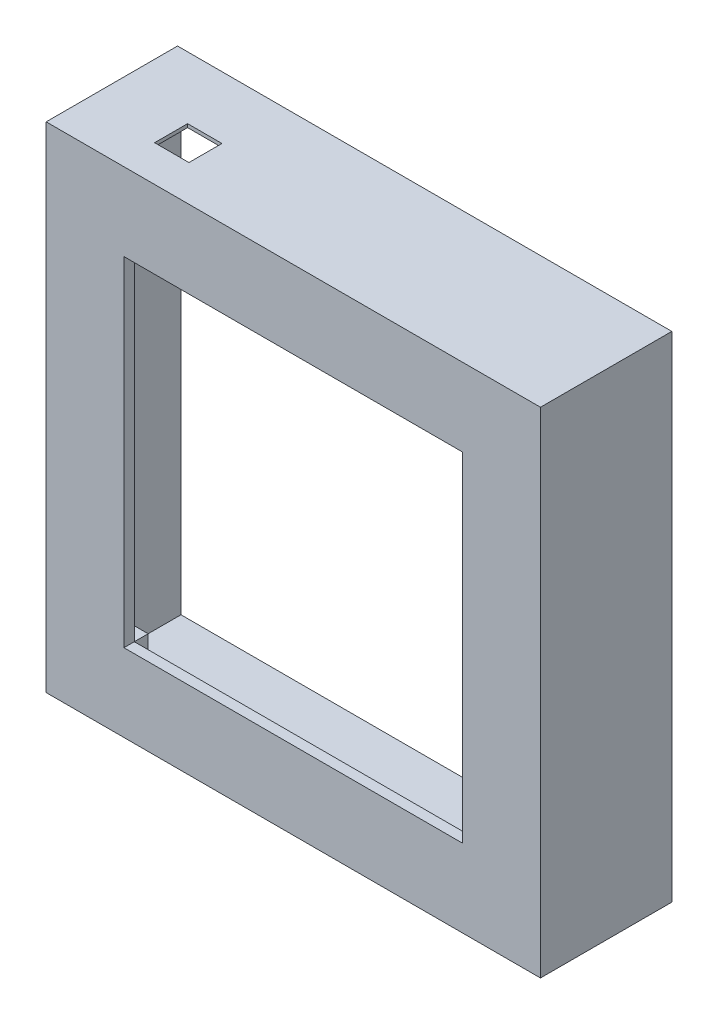
ISO-10303-21;
HEADER;
FILE_DESCRIPTION(('STEP AP214'),'2;1');
FILE_NAME('part.step','',(''),(''),'','','');
FILE_SCHEMA(('AUTOMOTIVE_DESIGN { 1 0 10303 214 1 1 1 1 }'));
ENDSEC;
DATA;
#1=APPLICATION_CONTEXT('core data for automotive mechanical design processes');
#2=APPLICATION_PROTOCOL_DEFINITION('international standard','automotive_design',2000,#1);
#3=PRODUCT_CONTEXT('',#1,'mechanical');
#4=PRODUCT('Part','Part','',(#3));
#5=PRODUCT_RELATED_PRODUCT_CATEGORY('part','',(#4));
#6=PRODUCT_DEFINITION_FORMATION('','',#4);
#7=PRODUCT_DEFINITION_CONTEXT('part definition',#1,'design');
#8=PRODUCT_DEFINITION('design','',#6,#7);
#9=PRODUCT_DEFINITION_SHAPE('','',#8);
#10=(LENGTH_UNIT() NAMED_UNIT(*) SI_UNIT(.MILLI.,.METRE.));
#11=(NAMED_UNIT(*) PLANE_ANGLE_UNIT() SI_UNIT($,.RADIAN.));
#12=(NAMED_UNIT(*) SI_UNIT($,.STERADIAN.) SOLID_ANGLE_UNIT());
#13=UNCERTAINTY_MEASURE_WITH_UNIT(LENGTH_MEASURE(1.E-05),#10,'distance_accuracy_value','');
#14=(GEOMETRIC_REPRESENTATION_CONTEXT(3) GLOBAL_UNCERTAINTY_ASSIGNED_CONTEXT((#13)) GLOBAL_UNIT_ASSIGNED_CONTEXT((#10,
#11,#12)) REPRESENTATION_CONTEXT('',''));
#15=CARTESIAN_POINT('',(0.,0.,0.));
#16=DIRECTION('',(0.,0.,1.));
#17=DIRECTION('',(1.,0.,0.));
#18=AXIS2_PLACEMENT_3D('',#15,#16,#17);
#19=CARTESIAN_POINT('',(0.,0.,0.));
#20=DIRECTION('',(0.,0.,-1.));
#21=DIRECTION('',(-1.,0.,0.));
#22=AXIS2_PLACEMENT_3D('',#19,#20,#21);
#23=PLANE('',#22);
#24=DIRECTION('',(-1.,0.,0.));
#25=VECTOR('',#24,1.);
#26=CARTESIAN_POINT('',(-49.,49.,0.));
#27=LINE('',#26,#25);
#28=CARTESIAN_POINT('',(49.,49.,0.));
#29=VERTEX_POINT('',#28);
#30=CARTESIAN_POINT('',(-49.,49.,0.));
#31=VERTEX_POINT('',#30);
#32=EDGE_CURVE('E391',#29,#31,#27,.T.);
#33=ORIENTED_EDGE('',*,*,#32,.T.);
#34=DIRECTION('',(0.,-1.,0.));
#35=VECTOR('',#34,1.);
#36=CARTESIAN_POINT('',(-49.,70.5,0.));
#37=LINE('',#36,#35);
#38=CARTESIAN_POINT('',(-49.,70.5,0.));
#39=VERTEX_POINT('',#38);
#40=EDGE_CURVE('E242',#39,#31,#37,.T.);
#41=ORIENTED_EDGE('',*,*,#40,.F.);
#42=DIRECTION('',(1.,0.,0.));
#43=VECTOR('',#42,1.);
#44=CARTESIAN_POINT('',(70.5,70.5,0.));
#45=LINE('',#44,#43);
#46=CARTESIAN_POINT('',(49.,70.5,0.));
#47=VERTEX_POINT('',#46);
#48=EDGE_CURVE('E347',#39,#47,#45,.T.);
#49=ORIENTED_EDGE('',*,*,#48,.T.);
#50=DIRECTION('',(0.,1.,0.));
#51=VECTOR('',#50,1.);
#52=CARTESIAN_POINT('',(49.,70.5,0.));
#53=LINE('',#52,#51);
#54=EDGE_CURVE('E312',#29,#47,#53,.T.);
#55=ORIENTED_EDGE('',*,*,#54,.F.);
#56=EDGE_LOOP('',(#33,#41,#49,#55));
#57=FACE_BOUND('',#56,.T.);
#58=ADVANCED_FACE('F35',(#57),#23,.T.);
#59=DIRECTION('',(0.,1.,0.));
#60=VECTOR('',#59,1.);
#61=CARTESIAN_POINT('',(-70.5,-70.5,0.));
#62=LINE('',#61,#60);
#63=CARTESIAN_POINT('',(-70.5,-49.,0.));
#64=VERTEX_POINT('',#63);
#65=CARTESIAN_POINT('',(-70.5,49.,0.));
#66=VERTEX_POINT('',#65);
#67=EDGE_CURVE('E333',#64,#66,#62,.T.);
#68=ORIENTED_EDGE('',*,*,#67,.T.);
#69=DIRECTION('',(-1.,0.,0.));
#70=VECTOR('',#69,1.);
#71=CARTESIAN_POINT('',(-70.5,49.,0.));
#72=LINE('',#71,#70);
#73=EDGE_CURVE('E246',#31,#66,#72,.T.);
#74=ORIENTED_EDGE('',*,*,#73,.F.);
#75=DIRECTION('',(0.,-1.,0.));
#76=VECTOR('',#75,1.);
#77=CARTESIAN_POINT('',(-49.,-49.,0.));
#78=LINE('',#77,#76);
#79=CARTESIAN_POINT('',(-49.,-49.,0.));
#80=VERTEX_POINT('',#79);
#81=EDGE_CURVE('E394',#31,#80,#78,.T.);
#82=ORIENTED_EDGE('',*,*,#81,.T.);
#83=DIRECTION('',(1.,0.,0.));
#84=VECTOR('',#83,1.);
#85=CARTESIAN_POINT('',(-70.5,-49.,0.));
#86=LINE('',#85,#84);
#87=EDGE_CURVE('E262',#64,#80,#86,.T.);
#88=ORIENTED_EDGE('',*,*,#87,.F.);
#89=EDGE_LOOP('',(#68,#74,#82,#88));
#90=FACE_BOUND('',#89,.T.);
#91=ADVANCED_FACE('F452',(#90),#23,.T.);
#92=CARTESIAN_POINT('',(-70.5,-70.5,-35.));
#93=DIRECTION('',(1.,0.,0.));
#94=DIRECTION('',(0.,0.,-1.));
#95=AXIS2_PLACEMENT_3D('',#92,#93,#94);
#96=PLANE('',#95);
#97=DIRECTION('',(0.,1.,0.));
#98=VECTOR('',#97,1.);
#99=CARTESIAN_POINT('',(-70.5,70.5,-4.));
#100=LINE('',#99,#98);
#101=CARTESIAN_POINT('',(-70.5,49.,-4.));
#102=VERTEX_POINT('',#101);
#103=CARTESIAN_POINT('',(-70.5,70.5,-4.));
#104=VERTEX_POINT('',#103);
#105=EDGE_CURVE('E243',#102,#104,#100,.T.);
#106=ORIENTED_EDGE('',*,*,#105,.F.);
#107=DIRECTION('',(0.,0.,1.));
#108=VECTOR('',#107,1.);
#109=CARTESIAN_POINT('',(-70.5,49.,-4.));
#110=LINE('',#109,#108);
#111=EDGE_CURVE('E252',#102,#66,#110,.T.);
#112=ORIENTED_EDGE('',*,*,#111,.T.);
#113=ORIENTED_EDGE('',*,*,#67,.F.);
#114=DIRECTION('',(0.,0.,1.));
#115=VECTOR('',#114,1.);
#116=CARTESIAN_POINT('',(-70.5,-49.,-4.));
#117=LINE('',#116,#115);
#118=CARTESIAN_POINT('',(-70.5,-49.,-4.));
#119=VERTEX_POINT('',#118);
#120=EDGE_CURVE('E284',#119,#64,#117,.T.);
#121=ORIENTED_EDGE('',*,*,#120,.F.);
#122=DIRECTION('',(0.,1.,0.));
#123=VECTOR('',#122,1.);
#124=CARTESIAN_POINT('',(-70.5,-70.5,-4.));
#125=LINE('',#124,#123);
#126=CARTESIAN_POINT('',(-70.5,-70.5,-4.));
#127=VERTEX_POINT('',#126);
#128=EDGE_CURVE('E263',#127,#119,#125,.T.);
#129=ORIENTED_EDGE('',*,*,#128,.F.);
#130=DIRECTION('',(0.,0.,1.));
#131=VECTOR('',#130,1.);
#132=CARTESIAN_POINT('',(-70.5,-70.5,-35.));
#133=LINE('',#132,#131);
#134=CARTESIAN_POINT('',(-70.5,-70.5,-35.));
#135=VERTEX_POINT('',#134);
#136=EDGE_CURVE('E344',#135,#127,#133,.T.);
#137=ORIENTED_EDGE('',*,*,#136,.F.);
#138=DIRECTION('',(0.,1.,0.));
#139=VECTOR('',#138,1.);
#140=CARTESIAN_POINT('',(-70.5,-70.5,-35.));
#141=LINE('',#140,#139);
#142=CARTESIAN_POINT('',(-70.5,70.5,-35.));
#143=VERTEX_POINT('',#142);
#144=EDGE_CURVE('E334',#135,#143,#141,.T.);
#145=ORIENTED_EDGE('',*,*,#144,.T.);
#146=DIRECTION('',(0.,0.,1.));
#147=VECTOR('',#146,1.);
#148=CARTESIAN_POINT('',(-70.5,70.5,-35.));
#149=LINE('',#148,#147);
#150=EDGE_CURVE('E362',#143,#104,#149,.T.);
#151=ORIENTED_EDGE('',*,*,#150,.T.);
#152=EDGE_LOOP('',(#106,#112,#113,#121,#129,#137,#145,#151));
#153=FACE_BOUND('',#152,.T.);
#154=ADVANCED_FACE('F459',(#153),#96,.T.);
#155=CARTESIAN_POINT('',(70.5,70.5,-35.));
#156=DIRECTION('',(0.,-1.,0.));
#157=DIRECTION('',(0.,0.,-1.));
#158=AXIS2_PLACEMENT_3D('',#155,#156,#157);
#159=PLANE('',#158);
#160=DIRECTION('',(0.,0.,-1.));
#161=VECTOR('',#160,1.);
#162=CARTESIAN_POINT('',(-50.5884615001161,70.5,-35.));
#163=LINE('',#162,#161);
#164=CARTESIAN_POINT('',(-50.5884615001161,70.5,-7.45399366961408));
#165=VERTEX_POINT('',#164);
#166=CARTESIAN_POINT('',(-50.5884615001161,70.5,-17.003856299738));
#167=VERTEX_POINT('',#166);
#168=EDGE_CURVE('E240',#165,#167,#163,.T.);
#169=ORIENTED_EDGE('',*,*,#168,.F.);
#170=DIRECTION('',(-1.,0.,0.));
#171=VECTOR('',#170,1.);
#172=CARTESIAN_POINT('',(70.5,70.5,-7.45399366961408));
#173=LINE('',#172,#171);
#174=CARTESIAN_POINT('',(-40.651442276879,70.5,-7.45399366961408));
#175=VERTEX_POINT('',#174);
#176=EDGE_CURVE('E233',#175,#165,#173,.T.);
#177=ORIENTED_EDGE('',*,*,#176,.F.);
#178=DIRECTION('',(0.,0.,1.));
#179=VECTOR('',#178,1.);
#180=CARTESIAN_POINT('',(-40.651442276879,70.5,-35.));
#181=LINE('',#180,#179);
#182=CARTESIAN_POINT('',(-40.651442276879,70.5,-17.003856299738));
#183=VERTEX_POINT('',#182);
#184=EDGE_CURVE('E213',#183,#175,#181,.T.);
#185=ORIENTED_EDGE('',*,*,#184,.F.);
#186=DIRECTION('',(1.,0.,0.));
#187=VECTOR('',#186,1.);
#188=CARTESIAN_POINT('',(70.5,70.5,-17.003856299738));
#189=LINE('',#188,#187);
#190=EDGE_CURVE('E238',#167,#183,#189,.T.);
#191=ORIENTED_EDGE('',*,*,#190,.F.);
#192=EDGE_LOOP('',(#169,#177,#185,#191));
#193=FACE_BOUND('',#192,.T.);
#194=ORIENTED_EDGE('',*,*,#48,.F.);
#195=DIRECTION('',(0.,0.,1.));
#196=VECTOR('',#195,1.);
#197=CARTESIAN_POINT('',(-49.,70.5,-4.));
#198=LINE('',#197,#196);
#199=CARTESIAN_POINT('',(-49.,70.5,-4.));
#200=VERTEX_POINT('',#199);
#201=EDGE_CURVE('E260',#200,#39,#198,.T.);
#202=ORIENTED_EDGE('',*,*,#201,.F.);
#203=DIRECTION('',(1.,0.,0.));
#204=VECTOR('',#203,1.);
#205=CARTESIAN_POINT('',(-70.5,70.5,-4.));
#206=LINE('',#205,#204);
#207=EDGE_CURVE('E245',#104,#200,#206,.T.);
#208=ORIENTED_EDGE('',*,*,#207,.F.);
#209=ORIENTED_EDGE('',*,*,#150,.F.);
#210=DIRECTION('',(1.,0.,0.));
#211=VECTOR('',#210,1.);
#212=CARTESIAN_POINT('',(70.5,70.5,-35.));
#213=LINE('',#212,#211);
#214=CARTESIAN_POINT('',(70.5,70.5,-35.));
#215=VERTEX_POINT('',#214);
#216=EDGE_CURVE('E336',#143,#215,#213,.T.);
#217=ORIENTED_EDGE('',*,*,#216,.T.);
#218=DIRECTION('',(0.,0.,1.));
#219=VECTOR('',#218,1.);
#220=CARTESIAN_POINT('',(70.5,70.5,-35.));
#221=LINE('',#220,#219);
#222=CARTESIAN_POINT('',(70.5,70.5,-4.));
#223=VERTEX_POINT('',#222);
#224=EDGE_CURVE('E359',#215,#223,#221,.T.);
#225=ORIENTED_EDGE('',*,*,#224,.T.);
#226=DIRECTION('',(1.,0.,0.));
#227=VECTOR('',#226,1.);
#228=CARTESIAN_POINT('',(70.5,70.5,-4.));
#229=LINE('',#228,#227);
#230=CARTESIAN_POINT('',(49.,70.5,-4.));
#231=VERTEX_POINT('',#230);
#232=EDGE_CURVE('E317',#231,#223,#229,.T.);
#233=ORIENTED_EDGE('',*,*,#232,.F.);
#234=DIRECTION('',(0.,0.,1.));
#235=VECTOR('',#234,1.);
#236=CARTESIAN_POINT('',(49.,70.5,-4.));
#237=LINE('',#236,#235);
#238=EDGE_CURVE('E320',#231,#47,#237,.T.);
#239=ORIENTED_EDGE('',*,*,#238,.T.);
#240=EDGE_LOOP('',(#194,#202,#208,#209,#217,#225,#233,#239));
#241=FACE_BOUND('',#240,.T.);
#242=ADVANCED_FACE('F475',(#193,#241),#159,.T.);
#243=DIRECTION('',(-1.,0.,0.));
#244=VECTOR('',#243,1.);
#245=CARTESIAN_POINT('',(70.5,-70.5,0.));
#246=LINE('',#245,#244);
#247=CARTESIAN_POINT('',(49.,-70.5,0.));
#248=VERTEX_POINT('',#247);
#249=CARTESIAN_POINT('',(-49.,-70.5,0.));
#250=VERTEX_POINT('',#249);
#251=EDGE_CURVE('E337',#248,#250,#246,.T.);
#252=ORIENTED_EDGE('',*,*,#251,.T.);
#253=DIRECTION('',(0.,-1.,0.));
#254=VECTOR('',#253,1.);
#255=CARTESIAN_POINT('',(-49.,-70.5,0.));
#256=LINE('',#255,#254);
#257=EDGE_CURVE('E267',#80,#250,#256,.T.);
#258=ORIENTED_EDGE('',*,*,#257,.F.);
#259=DIRECTION('',(1.,0.,0.));
#260=VECTOR('',#259,1.);
#261=CARTESIAN_POINT('',(-49.,-49.,0.));
#262=LINE('',#261,#260);
#263=CARTESIAN_POINT('',(49.,-49.,0.));
#264=VERTEX_POINT('',#263);
#265=EDGE_CURVE('E381',#80,#264,#262,.T.);
#266=ORIENTED_EDGE('',*,*,#265,.T.);
#267=DIRECTION('',(0.,1.,0.));
#268=VECTOR('',#267,1.);
#269=CARTESIAN_POINT('',(49.,-70.5,0.));
#270=LINE('',#269,#268);
#271=EDGE_CURVE('E287',#248,#264,#270,.T.);
#272=ORIENTED_EDGE('',*,*,#271,.F.);
#273=EDGE_LOOP('',(#252,#258,#266,#272));
#274=FACE_BOUND('',#273,.T.);
#275=ADVANCED_FACE('F461',(#274),#23,.T.);
#276=CARTESIAN_POINT('',(70.5,-70.5,-35.));
#277=DIRECTION('',(0.,1.,0.));
#278=DIRECTION('',(0.,0.,1.));
#279=AXIS2_PLACEMENT_3D('',#276,#277,#278);
#280=PLANE('',#279);
#281=DIRECTION('',(-1.,0.,0.));
#282=VECTOR('',#281,1.);
#283=CARTESIAN_POINT('',(-70.5,-70.5,-4.));
#284=LINE('',#283,#282);
#285=CARTESIAN_POINT('',(-49.,-70.5,-4.));
#286=VERTEX_POINT('',#285);
#287=EDGE_CURVE('E272',#286,#127,#284,.T.);
#288=ORIENTED_EDGE('',*,*,#287,.F.);
#289=DIRECTION('',(0.,0.,1.));
#290=VECTOR('',#289,1.);
#291=CARTESIAN_POINT('',(-49.,-70.5,-4.));
#292=LINE('',#291,#290);
#293=EDGE_CURVE('E275',#286,#250,#292,.T.);
#294=ORIENTED_EDGE('',*,*,#293,.T.);
#295=ORIENTED_EDGE('',*,*,#251,.F.);
#296=DIRECTION('',(0.,0.,1.));
#297=VECTOR('',#296,1.);
#298=CARTESIAN_POINT('',(49.,-70.5,-4.));
#299=LINE('',#298,#297);
#300=CARTESIAN_POINT('',(49.,-70.5,-4.));
#301=VERTEX_POINT('',#300);
#302=EDGE_CURVE('E305',#301,#248,#299,.T.);
#303=ORIENTED_EDGE('',*,*,#302,.F.);
#304=DIRECTION('',(-1.,0.,0.));
#305=VECTOR('',#304,1.);
#306=CARTESIAN_POINT('',(70.5,-70.5,-4.));
#307=LINE('',#306,#305);
#308=CARTESIAN_POINT('',(70.5,-70.5,-4.));
#309=VERTEX_POINT('',#308);
#310=EDGE_CURVE('E290',#309,#301,#307,.T.);
#311=ORIENTED_EDGE('',*,*,#310,.F.);
#312=DIRECTION('',(0.,0.,1.));
#313=VECTOR('',#312,1.);
#314=CARTESIAN_POINT('',(70.5,-70.5,-35.));
#315=LINE('',#314,#313);
#316=CARTESIAN_POINT('',(70.5,-70.5,-35.));
#317=VERTEX_POINT('',#316);
#318=EDGE_CURVE('E356',#317,#309,#315,.T.);
#319=ORIENTED_EDGE('',*,*,#318,.F.);
#320=DIRECTION('',(-1.,0.,0.));
#321=VECTOR('',#320,1.);
#322=CARTESIAN_POINT('',(70.5,-70.5,-35.));
#323=LINE('',#322,#321);
#324=EDGE_CURVE('E342',#317,#135,#323,.T.);
#325=ORIENTED_EDGE('',*,*,#324,.T.);
#326=ORIENTED_EDGE('',*,*,#136,.T.);
#327=EDGE_LOOP('',(#288,#294,#295,#303,#311,#319,#325,#326));
#328=FACE_BOUND('',#327,.T.);
#329=ADVANCED_FACE('F464',(#328),#280,.T.);
#330=DIRECTION('',(0.,-1.,0.));
#331=VECTOR('',#330,1.);
#332=CARTESIAN_POINT('',(70.5,-70.5,0.));
#333=LINE('',#332,#331);
#334=CARTESIAN_POINT('',(70.5,49.,0.));
#335=VERTEX_POINT('',#334);
#336=CARTESIAN_POINT('',(70.5,-49.,0.));
#337=VERTEX_POINT('',#336);
#338=EDGE_CURVE('E349',#335,#337,#333,.T.);
#339=ORIENTED_EDGE('',*,*,#338,.T.);
#340=DIRECTION('',(1.,0.,0.));
#341=VECTOR('',#340,1.);
#342=CARTESIAN_POINT('',(70.5,-49.,0.));
#343=LINE('',#342,#341);
#344=EDGE_CURVE('E291',#264,#337,#343,.T.);
#345=ORIENTED_EDGE('',*,*,#344,.F.);
#346=DIRECTION('',(0.,1.,0.));
#347=VECTOR('',#346,1.);
#348=CARTESIAN_POINT('',(49.,-49.,0.));
#349=LINE('',#348,#347);
#350=EDGE_CURVE('E377',#264,#29,#349,.T.);
#351=ORIENTED_EDGE('',*,*,#350,.T.);
#352=DIRECTION('',(-1.,0.,0.));
#353=VECTOR('',#352,1.);
#354=CARTESIAN_POINT('',(70.5,49.,0.));
#355=LINE('',#354,#353);
#356=EDGE_CURVE('E307',#335,#29,#355,.T.);
#357=ORIENTED_EDGE('',*,*,#356,.F.);
#358=EDGE_LOOP('',(#339,#345,#351,#357));
#359=FACE_BOUND('',#358,.T.);
#360=ADVANCED_FACE('F455',(#359),#23,.T.);
#361=CARTESIAN_POINT('',(70.5,-70.5,-35.));
#362=DIRECTION('',(-1.,0.,0.));
#363=DIRECTION('',(0.,0.,1.));
#364=AXIS2_PLACEMENT_3D('',#361,#362,#363);
#365=PLANE('',#364);
#366=DIRECTION('',(0.,-1.,0.));
#367=VECTOR('',#366,1.);
#368=CARTESIAN_POINT('',(70.5,-70.5,-4.));
#369=LINE('',#368,#367);
#370=CARTESIAN_POINT('',(70.5,-49.,-4.));
#371=VERTEX_POINT('',#370);
#372=EDGE_CURVE('E288',#371,#309,#369,.T.);
#373=ORIENTED_EDGE('',*,*,#372,.F.);
#374=DIRECTION('',(0.,0.,1.));
#375=VECTOR('',#374,1.);
#376=CARTESIAN_POINT('',(70.5,-49.,-4.));
#377=LINE('',#376,#375);
#378=EDGE_CURVE('E297',#371,#337,#377,.T.);
#379=ORIENTED_EDGE('',*,*,#378,.T.);
#380=ORIENTED_EDGE('',*,*,#338,.F.);
#381=DIRECTION('',(0.,0.,1.));
#382=VECTOR('',#381,1.);
#383=CARTESIAN_POINT('',(70.5,49.,-4.));
#384=LINE('',#383,#382);
#385=CARTESIAN_POINT('',(70.5,49.,-4.));
#386=VERTEX_POINT('',#385);
#387=EDGE_CURVE('E330',#386,#335,#384,.T.);
#388=ORIENTED_EDGE('',*,*,#387,.F.);
#389=DIRECTION('',(0.,-1.,0.));
#390=VECTOR('',#389,1.);
#391=CARTESIAN_POINT('',(70.5,70.5,-4.));
#392=LINE('',#391,#390);
#393=EDGE_CURVE('E308',#223,#386,#392,.T.);
#394=ORIENTED_EDGE('',*,*,#393,.F.);
#395=ORIENTED_EDGE('',*,*,#224,.F.);
#396=DIRECTION('',(0.,-1.,0.));
#397=VECTOR('',#396,1.);
#398=CARTESIAN_POINT('',(70.5,-70.5,-35.));
#399=LINE('',#398,#397);
#400=EDGE_CURVE('E339',#215,#317,#399,.T.);
#401=ORIENTED_EDGE('',*,*,#400,.T.);
#402=ORIENTED_EDGE('',*,*,#318,.T.);
#403=EDGE_LOOP('',(#373,#379,#380,#388,#394,#395,#401,#402));
#404=FACE_BOUND('',#403,.T.);
#405=ADVANCED_FACE('F449',(#404),#365,.T.);
#406=CARTESIAN_POINT('',(0.,0.,3.));
#407=DIRECTION('',(0.,0.,-1.));
#408=DIRECTION('',(-1.,0.,0.));
#409=AXIS2_PLACEMENT_3D('',#406,#407,#408);
#410=PLANE('',#409);
#411=DIRECTION('',(0.,1.,0.));
#412=VECTOR('',#411,1.);
#413=CARTESIAN_POINT('',(71.5,-71.5,3.));
#414=LINE('',#413,#412);
#415=CARTESIAN_POINT('',(71.5,-71.5,3.));
#416=VERTEX_POINT('',#415);
#417=CARTESIAN_POINT('',(71.5,71.5,3.));
#418=VERTEX_POINT('',#417);
#419=EDGE_CURVE('E410',#416,#418,#414,.T.);
#420=ORIENTED_EDGE('',*,*,#419,.T.);
#421=DIRECTION('',(-1.,0.,0.));
#422=VECTOR('',#421,1.);
#423=CARTESIAN_POINT('',(-71.5,71.5,3.));
#424=LINE('',#423,#422);
#425=CARTESIAN_POINT('',(-71.5,71.5,3.));
#426=VERTEX_POINT('',#425);
#427=EDGE_CURVE('E413',#418,#426,#424,.T.);
#428=ORIENTED_EDGE('',*,*,#427,.T.);
#429=DIRECTION('',(0.,-1.,0.));
#430=VECTOR('',#429,1.);
#431=CARTESIAN_POINT('',(-71.5,-71.5,3.));
#432=LINE('',#431,#430);
#433=CARTESIAN_POINT('',(-71.5,-71.5,3.));
#434=VERTEX_POINT('',#433);
#435=EDGE_CURVE('E415',#426,#434,#432,.T.);
#436=ORIENTED_EDGE('',*,*,#435,.T.);
#437=DIRECTION('',(1.,0.,0.));
#438=VECTOR('',#437,1.);
#439=CARTESIAN_POINT('',(-71.5,-71.5,3.));
#440=LINE('',#439,#438);
#441=EDGE_CURVE('E417',#434,#416,#440,.T.);
#442=ORIENTED_EDGE('',*,*,#441,.T.);
#443=EDGE_LOOP('',(#420,#428,#436,#442));
#444=FACE_BOUND('',#443,.T.);
#445=DIRECTION('',(0.,1.,0.));
#446=VECTOR('',#445,1.);
#447=CARTESIAN_POINT('',(49.,-49.,3.));
#448=LINE('',#447,#446);
#449=CARTESIAN_POINT('',(49.,-49.,3.));
#450=VERTEX_POINT('',#449);
#451=CARTESIAN_POINT('',(49.,49.,3.));
#452=VERTEX_POINT('',#451);
#453=EDGE_CURVE('E378',#450,#452,#448,.T.);
#454=ORIENTED_EDGE('',*,*,#453,.F.);
#455=DIRECTION('',(1.,0.,0.));
#456=VECTOR('',#455,1.);
#457=CARTESIAN_POINT('',(-49.,-49.,3.));
#458=LINE('',#457,#456);
#459=CARTESIAN_POINT('',(-49.,-49.,3.));
#460=VERTEX_POINT('',#459);
#461=EDGE_CURVE('E386',#460,#450,#458,.T.);
#462=ORIENTED_EDGE('',*,*,#461,.F.);
#463=DIRECTION('',(0.,-1.,0.));
#464=VECTOR('',#463,1.);
#465=CARTESIAN_POINT('',(-49.,-49.,3.));
#466=LINE('',#465,#464);
#467=CARTESIAN_POINT('',(-49.,49.,3.));
#468=VERTEX_POINT('',#467);
#469=EDGE_CURVE('E383',#468,#460,#466,.T.);
#470=ORIENTED_EDGE('',*,*,#469,.F.);
#471=DIRECTION('',(-1.,0.,0.));
#472=VECTOR('',#471,1.);
#473=CARTESIAN_POINT('',(-49.,49.,3.));
#474=LINE('',#473,#472);
#475=EDGE_CURVE('E380',#452,#468,#474,.T.);
#476=ORIENTED_EDGE('',*,*,#475,.F.);
#477=EDGE_LOOP('',(#454,#462,#470,#476));
#478=FACE_BOUND('',#477,.T.);
#479=ADVANCED_FACE('F441',(#444,#478),#410,.F.);
#480=CARTESIAN_POINT('',(71.5,-71.5,3.));
#481=DIRECTION('',(-1.,0.,0.));
#482=DIRECTION('',(0.,0.,1.));
#483=AXIS2_PLACEMENT_3D('',#480,#481,#482);
#484=PLANE('',#483);
#485=DIRECTION('',(0.,0.,-1.));
#486=VECTOR('',#485,1.);
#487=CARTESIAN_POINT('',(71.5,-71.5,3.));
#488=LINE('',#487,#486);
#489=CARTESIAN_POINT('',(71.5,-71.5,-35.));
#490=VERTEX_POINT('',#489);
#491=EDGE_CURVE('E419',#416,#490,#488,.T.);
#492=ORIENTED_EDGE('',*,*,#491,.T.);
#493=DIRECTION('',(0.,-1.,0.));
#494=VECTOR('',#493,1.);
#495=CARTESIAN_POINT('',(71.5,-71.5,-35.));
#496=LINE('',#495,#494);
#497=CARTESIAN_POINT('',(71.5,71.5,-35.));
#498=VERTEX_POINT('',#497);
#499=EDGE_CURVE('E371',#498,#490,#496,.T.);
#500=ORIENTED_EDGE('',*,*,#499,.F.);
#501=DIRECTION('',(0.,0.,-1.));
#502=VECTOR('',#501,1.);
#503=CARTESIAN_POINT('',(71.5,71.5,3.));
#504=LINE('',#503,#502);
#505=EDGE_CURVE('E11',#418,#498,#504,.T.);
#506=ORIENTED_EDGE('',*,*,#505,.F.);
#507=ORIENTED_EDGE('',*,*,#419,.F.);
#508=EDGE_LOOP('',(#492,#500,#506,#507));
#509=FACE_BOUND('',#508,.T.);
#510=ADVANCED_FACE('F37',(#509),#484,.F.);
#511=CARTESIAN_POINT('',(-71.5,71.5,3.));
#512=DIRECTION('',(0.,-1.,0.));
#513=DIRECTION('',(0.,0.,-1.));
#514=AXIS2_PLACEMENT_3D('',#511,#512,#513);
#515=PLANE('',#514);
#516=DIRECTION('',(1.,0.,0.));
#517=VECTOR('',#516,1.);
#518=CARTESIAN_POINT('',(-50.5884615001161,71.5,-7.45399366961408));
#519=LINE('',#518,#517);
#520=CARTESIAN_POINT('',(-50.5884615001161,71.5,-7.45399366961408));
#521=VERTEX_POINT('',#520);
#522=CARTESIAN_POINT('',(-40.651442276879,71.5,-7.45399366961408));
#523=VERTEX_POINT('',#522);
#524=EDGE_CURVE('E219',#521,#523,#519,.T.);
#525=ORIENTED_EDGE('',*,*,#524,.F.);
#526=DIRECTION('',(0.,0.,1.));
#527=VECTOR('',#526,1.);
#528=CARTESIAN_POINT('',(-50.5884615001161,71.5,-7.45399366961408));
#529=LINE('',#528,#527);
#530=CARTESIAN_POINT('',(-50.5884615001161,71.5,-17.003856299738));
#531=VERTEX_POINT('',#530);
#532=EDGE_CURVE('E58',#531,#521,#529,.T.);
#533=ORIENTED_EDGE('',*,*,#532,.F.);
#534=DIRECTION('',(-1.,0.,0.));
#535=VECTOR('',#534,1.);
#536=CARTESIAN_POINT('',(-50.5884615001161,71.5,-17.003856299738));
#537=LINE('',#536,#535);
#538=CARTESIAN_POINT('',(-40.651442276879,71.5,-17.003856299738));
#539=VERTEX_POINT('',#538);
#540=EDGE_CURVE('E226',#539,#531,#537,.T.);
#541=ORIENTED_EDGE('',*,*,#540,.F.);
#542=DIRECTION('',(0.,0.,-1.));
#543=VECTOR('',#542,1.);
#544=CARTESIAN_POINT('',(-40.651442276879,71.5,-7.45399366961408));
#545=LINE('',#544,#543);
#546=EDGE_CURVE('E210',#523,#539,#545,.T.);
#547=ORIENTED_EDGE('',*,*,#546,.F.);
#548=EDGE_LOOP('',(#525,#533,#541,#547));
#549=FACE_BOUND('',#548,.T.);
#550=ORIENTED_EDGE('',*,*,#505,.T.);
#551=DIRECTION('',(1.,0.,0.));
#552=VECTOR('',#551,1.);
#553=CARTESIAN_POINT('',(71.5,71.5,-35.));
#554=LINE('',#553,#552);
#555=CARTESIAN_POINT('',(-71.5,71.5,-35.));
#556=VERTEX_POINT('',#555);
#557=EDGE_CURVE('E368',#556,#498,#554,.T.);
#558=ORIENTED_EDGE('',*,*,#557,.F.);
#559=DIRECTION('',(0.,0.,-1.));
#560=VECTOR('',#559,1.);
#561=CARTESIAN_POINT('',(-71.5,71.5,3.));
#562=LINE('',#561,#560);
#563=EDGE_CURVE('E43',#426,#556,#562,.T.);
#564=ORIENTED_EDGE('',*,*,#563,.F.);
#565=ORIENTED_EDGE('',*,*,#427,.F.);
#566=EDGE_LOOP('',(#550,#558,#564,#565));
#567=FACE_BOUND('',#566,.T.);
#568=ADVANCED_FACE('F223',(#549,#567),#515,.F.);
#569=CARTESIAN_POINT('',(-71.5,-71.5,3.));
#570=DIRECTION('',(1.,0.,0.));
#571=DIRECTION('',(0.,0.,-1.));
#572=AXIS2_PLACEMENT_3D('',#569,#570,#571);
#573=PLANE('',#572);
#574=ORIENTED_EDGE('',*,*,#563,.T.);
#575=DIRECTION('',(0.,1.,0.));
#576=VECTOR('',#575,1.);
#577=CARTESIAN_POINT('',(-71.5,-71.5,-35.));
#578=LINE('',#577,#576);
#579=CARTESIAN_POINT('',(-71.5,-71.5,-35.));
#580=VERTEX_POINT('',#579);
#581=EDGE_CURVE('E365',#580,#556,#578,.T.);
#582=ORIENTED_EDGE('',*,*,#581,.F.);
#583=DIRECTION('',(0.,0.,-1.));
#584=VECTOR('',#583,1.);
#585=CARTESIAN_POINT('',(-71.5,-71.5,3.));
#586=LINE('',#585,#584);
#587=EDGE_CURVE('E421',#434,#580,#586,.T.);
#588=ORIENTED_EDGE('',*,*,#587,.F.);
#589=ORIENTED_EDGE('',*,*,#435,.F.);
#590=EDGE_LOOP('',(#574,#582,#588,#589));
#591=FACE_BOUND('',#590,.T.);
#592=ADVANCED_FACE('F427',(#591),#573,.F.);
#593=CARTESIAN_POINT('',(-71.5,-71.5,3.));
#594=DIRECTION('',(0.,1.,0.));
#595=DIRECTION('',(0.,0.,1.));
#596=AXIS2_PLACEMENT_3D('',#593,#594,#595);
#597=PLANE('',#596);
#598=ORIENTED_EDGE('',*,*,#587,.T.);
#599=DIRECTION('',(-1.,0.,0.));
#600=VECTOR('',#599,1.);
#601=CARTESIAN_POINT('',(71.5,-71.5,-35.));
#602=LINE('',#601,#600);
#603=EDGE_CURVE('E374',#490,#580,#602,.T.);
#604=ORIENTED_EDGE('',*,*,#603,.F.);
#605=ORIENTED_EDGE('',*,*,#491,.F.);
#606=ORIENTED_EDGE('',*,*,#441,.F.);
#607=EDGE_LOOP('',(#598,#604,#605,#606));
#608=FACE_BOUND('',#607,.T.);
#609=ADVANCED_FACE('F437',(#608),#597,.F.);
#610=CARTESIAN_POINT('',(49.,-49.,3.));
#611=DIRECTION('',(-1.,0.,0.));
#612=DIRECTION('',(0.,0.,1.));
#613=AXIS2_PLACEMENT_3D('',#610,#611,#612);
#614=PLANE('',#613);
#615=ORIENTED_EDGE('',*,*,#350,.F.);
#616=DIRECTION('',(0.,0.,-1.));
#617=VECTOR('',#616,1.);
#618=CARTESIAN_POINT('',(49.,-49.,3.));
#619=LINE('',#618,#617);
#620=EDGE_CURVE('E388',#450,#264,#619,.T.);
#621=ORIENTED_EDGE('',*,*,#620,.F.);
#622=ORIENTED_EDGE('',*,*,#453,.T.);
#623=DIRECTION('',(0.,0.,-1.));
#624=VECTOR('',#623,1.);
#625=CARTESIAN_POINT('',(49.,49.,3.));
#626=LINE('',#625,#624);
#627=EDGE_CURVE('E407',#452,#29,#626,.T.);
#628=ORIENTED_EDGE('',*,*,#627,.T.);
#629=EDGE_LOOP('',(#615,#621,#622,#628));
#630=FACE_BOUND('',#629,.T.);
#631=ADVANCED_FACE('F534',(#630),#614,.T.);
#632=CARTESIAN_POINT('',(-49.,49.,3.));
#633=DIRECTION('',(0.,-1.,0.));
#634=DIRECTION('',(0.,0.,-1.));
#635=AXIS2_PLACEMENT_3D('',#632,#633,#634);
#636=PLANE('',#635);
#637=ORIENTED_EDGE('',*,*,#32,.F.);
#638=ORIENTED_EDGE('',*,*,#627,.F.);
#639=ORIENTED_EDGE('',*,*,#475,.T.);
#640=DIRECTION('',(0.,0.,-1.));
#641=VECTOR('',#640,1.);
#642=CARTESIAN_POINT('',(-49.,49.,3.));
#643=LINE('',#642,#641);
#644=EDGE_CURVE('E404',#468,#31,#643,.T.);
#645=ORIENTED_EDGE('',*,*,#644,.T.);
#646=EDGE_LOOP('',(#637,#638,#639,#645));
#647=FACE_BOUND('',#646,.T.);
#648=ADVANCED_FACE('F506',(#647),#636,.T.);
#649=CARTESIAN_POINT('',(-49.,-49.,3.));
#650=DIRECTION('',(1.,0.,0.));
#651=DIRECTION('',(0.,0.,-1.));
#652=AXIS2_PLACEMENT_3D('',#649,#650,#651);
#653=PLANE('',#652);
#654=ORIENTED_EDGE('',*,*,#81,.F.);
#655=ORIENTED_EDGE('',*,*,#644,.F.);
#656=ORIENTED_EDGE('',*,*,#469,.T.);
#657=DIRECTION('',(0.,0.,-1.));
#658=VECTOR('',#657,1.);
#659=CARTESIAN_POINT('',(-49.,-49.,3.));
#660=LINE('',#659,#658);
#661=EDGE_CURVE('E401',#460,#80,#660,.T.);
#662=ORIENTED_EDGE('',*,*,#661,.T.);
#663=EDGE_LOOP('',(#654,#655,#656,#662));
#664=FACE_BOUND('',#663,.T.);
#665=ADVANCED_FACE('F511',(#664),#653,.T.);
#666=CARTESIAN_POINT('',(-49.,-49.,3.));
#667=DIRECTION('',(0.,1.,0.));
#668=DIRECTION('',(0.,0.,1.));
#669=AXIS2_PLACEMENT_3D('',#666,#667,#668);
#670=PLANE('',#669);
#671=ORIENTED_EDGE('',*,*,#265,.F.);
#672=ORIENTED_EDGE('',*,*,#661,.F.);
#673=ORIENTED_EDGE('',*,*,#461,.T.);
#674=ORIENTED_EDGE('',*,*,#620,.T.);
#675=EDGE_LOOP('',(#671,#672,#673,#674));
#676=FACE_BOUND('',#675,.T.);
#677=ADVANCED_FACE('F537',(#676),#670,.T.);
#678=CARTESIAN_POINT('',(0.,0.,-35.));
#679=DIRECTION('',(0.,0.,1.));
#680=DIRECTION('',(1.,0.,0.));
#681=AXIS2_PLACEMENT_3D('',#678,#679,#680);
#682=PLANE('',#681);
#683=ORIENTED_EDGE('',*,*,#581,.T.);
#684=ORIENTED_EDGE('',*,*,#557,.T.);
#685=ORIENTED_EDGE('',*,*,#499,.T.);
#686=ORIENTED_EDGE('',*,*,#603,.T.);
#687=EDGE_LOOP('',(#683,#684,#685,#686));
#688=FACE_BOUND('',#687,.T.);
#689=ORIENTED_EDGE('',*,*,#144,.F.);
#690=ORIENTED_EDGE('',*,*,#324,.F.);
#691=ORIENTED_EDGE('',*,*,#400,.F.);
#692=ORIENTED_EDGE('',*,*,#216,.F.);
#693=EDGE_LOOP('',(#689,#690,#691,#692));
#694=FACE_BOUND('',#693,.T.);
#695=ADVANCED_FACE('F432',(#688,#694),#682,.F.);
#696=CARTESIAN_POINT('',(70.5,49.,-4.));
#697=DIRECTION('',(0.,1.,0.));
#698=DIRECTION('',(0.,0.,1.));
#699=AXIS2_PLACEMENT_3D('',#696,#697,#698);
#700=PLANE('',#699);
#701=ORIENTED_EDGE('',*,*,#356,.T.);
#702=DIRECTION('',(0.,0.,1.));
#703=VECTOR('',#702,1.);
#704=CARTESIAN_POINT('',(49.,49.,-4.));
#705=LINE('',#704,#703);
#706=CARTESIAN_POINT('',(49.,49.,-4.));
#707=VERTEX_POINT('',#706);
#708=EDGE_CURVE('E327',#707,#29,#705,.T.);
#709=ORIENTED_EDGE('',*,*,#708,.F.);
#710=DIRECTION('',(-1.,0.,0.));
#711=VECTOR('',#710,1.);
#712=CARTESIAN_POINT('',(70.5,49.,-4.));
#713=LINE('',#712,#711);
#714=EDGE_CURVE('E311',#386,#707,#713,.T.);
#715=ORIENTED_EDGE('',*,*,#714,.F.);
#716=ORIENTED_EDGE('',*,*,#387,.T.);
#717=EDGE_LOOP('',(#701,#709,#715,#716));
#718=FACE_BOUND('',#717,.T.);
#719=ADVANCED_FACE('F522',(#718),#700,.F.);
#720=CARTESIAN_POINT('',(49.,70.5,-4.));
#721=DIRECTION('',(1.,0.,0.));
#722=DIRECTION('',(0.,0.,-1.));
#723=AXIS2_PLACEMENT_3D('',#720,#721,#722);
#724=PLANE('',#723);
#725=ORIENTED_EDGE('',*,*,#54,.T.);
#726=ORIENTED_EDGE('',*,*,#238,.F.);
#727=DIRECTION('',(0.,1.,0.));
#728=VECTOR('',#727,1.);
#729=CARTESIAN_POINT('',(49.,70.5,-4.));
#730=LINE('',#729,#728);
#731=EDGE_CURVE('E314',#707,#231,#730,.T.);
#732=ORIENTED_EDGE('',*,*,#731,.F.);
#733=ORIENTED_EDGE('',*,*,#708,.T.);
#734=EDGE_LOOP('',(#725,#726,#732,#733));
#735=FACE_BOUND('',#734,.T.);
#736=ADVANCED_FACE('F517',(#735),#724,.F.);
#737=CARTESIAN_POINT('',(0.,0.,-4.));
#738=DIRECTION('',(0.,0.,-1.));
#739=DIRECTION('',(-1.,0.,0.));
#740=AXIS2_PLACEMENT_3D('',#737,#738,#739);
#741=PLANE('',#740);
#742=ORIENTED_EDGE('',*,*,#393,.T.);
#743=ORIENTED_EDGE('',*,*,#714,.T.);
#744=ORIENTED_EDGE('',*,*,#731,.T.);
#745=ORIENTED_EDGE('',*,*,#232,.T.);
#746=EDGE_LOOP('',(#742,#743,#744,#745));
#747=FACE_BOUND('',#746,.T.);
#748=ADVANCED_FACE('F639',(#747),#741,.T.);
#749=CARTESIAN_POINT('',(49.,-70.5,-4.));
#750=DIRECTION('',(1.,0.,0.));
#751=DIRECTION('',(0.,0.,-1.));
#752=AXIS2_PLACEMENT_3D('',#749,#750,#751);
#753=PLANE('',#752);
#754=ORIENTED_EDGE('',*,*,#271,.T.);
#755=DIRECTION('',(0.,0.,1.));
#756=VECTOR('',#755,1.);
#757=CARTESIAN_POINT('',(49.,-49.,-4.));
#758=LINE('',#757,#756);
#759=CARTESIAN_POINT('',(49.,-49.,-4.));
#760=VERTEX_POINT('',#759);
#761=EDGE_CURVE('E302',#760,#264,#758,.T.);
#762=ORIENTED_EDGE('',*,*,#761,.F.);
#763=DIRECTION('',(0.,1.,0.));
#764=VECTOR('',#763,1.);
#765=CARTESIAN_POINT('',(49.,-70.5,-4.));
#766=LINE('',#765,#764);
#767=EDGE_CURVE('E293',#301,#760,#766,.T.);
#768=ORIENTED_EDGE('',*,*,#767,.F.);
#769=ORIENTED_EDGE('',*,*,#302,.T.);
#770=EDGE_LOOP('',(#754,#762,#768,#769));
#771=FACE_BOUND('',#770,.T.);
#772=ADVANCED_FACE('F636',(#771),#753,.F.);
#773=CARTESIAN_POINT('',(70.5,-49.,-4.));
#774=DIRECTION('',(0.,-1.,0.));
#775=DIRECTION('',(0.,0.,-1.));
#776=AXIS2_PLACEMENT_3D('',#773,#774,#775);
#777=PLANE('',#776);
#778=ORIENTED_EDGE('',*,*,#344,.T.);
#779=ORIENTED_EDGE('',*,*,#378,.F.);
#780=DIRECTION('',(1.,0.,0.));
#781=VECTOR('',#780,1.);
#782=CARTESIAN_POINT('',(70.5,-49.,-4.));
#783=LINE('',#782,#781);
#784=EDGE_CURVE('E295',#760,#371,#783,.T.);
#785=ORIENTED_EDGE('',*,*,#784,.F.);
#786=ORIENTED_EDGE('',*,*,#761,.T.);
#787=EDGE_LOOP('',(#778,#779,#785,#786));
#788=FACE_BOUND('',#787,.T.);
#789=ADVANCED_FACE('F530',(#788),#777,.F.);
#790=CARTESIAN_POINT('',(0.,0.,-4.));
#791=DIRECTION('',(0.,0.,1.));
#792=DIRECTION('',(1.,0.,0.));
#793=AXIS2_PLACEMENT_3D('',#790,#791,#792);
#794=PLANE('',#793);
#795=ORIENTED_EDGE('',*,*,#372,.T.);
#796=ORIENTED_EDGE('',*,*,#310,.T.);
#797=ORIENTED_EDGE('',*,*,#767,.T.);
#798=ORIENTED_EDGE('',*,*,#784,.T.);
#799=EDGE_LOOP('',(#795,#796,#797,#798));
#800=FACE_BOUND('',#799,.T.);
#801=ADVANCED_FACE('F630',(#800),#794,.F.);
#802=CARTESIAN_POINT('',(-70.5,-49.,-4.));
#803=DIRECTION('',(0.,-1.,0.));
#804=DIRECTION('',(0.,0.,-1.));
#805=AXIS2_PLACEMENT_3D('',#802,#803,#804);
#806=PLANE('',#805);
#807=ORIENTED_EDGE('',*,*,#87,.T.);
#808=DIRECTION('',(0.,0.,1.));
#809=VECTOR('',#808,1.);
#810=CARTESIAN_POINT('',(-49.,-49.,-4.));
#811=LINE('',#810,#809);
#812=CARTESIAN_POINT('',(-49.,-49.,-4.));
#813=VERTEX_POINT('',#812);
#814=EDGE_CURVE('E281',#813,#80,#811,.T.);
#815=ORIENTED_EDGE('',*,*,#814,.F.);
#816=DIRECTION('',(1.,0.,0.));
#817=VECTOR('',#816,1.);
#818=CARTESIAN_POINT('',(-70.5,-49.,-4.));
#819=LINE('',#818,#817);
#820=EDGE_CURVE('E266',#119,#813,#819,.T.);
#821=ORIENTED_EDGE('',*,*,#820,.F.);
#822=ORIENTED_EDGE('',*,*,#120,.T.);
#823=EDGE_LOOP('',(#807,#815,#821,#822));
#824=FACE_BOUND('',#823,.T.);
#825=ADVANCED_FACE('F492',(#824),#806,.F.);
#826=CARTESIAN_POINT('',(-49.,-70.5,-4.));
#827=DIRECTION('',(-1.,0.,0.));
#828=DIRECTION('',(0.,0.,1.));
#829=AXIS2_PLACEMENT_3D('',#826,#827,#828);
#830=PLANE('',#829);
#831=ORIENTED_EDGE('',*,*,#257,.T.);
#832=ORIENTED_EDGE('',*,*,#293,.F.);
#833=DIRECTION('',(0.,-1.,0.));
#834=VECTOR('',#833,1.);
#835=CARTESIAN_POINT('',(-49.,-70.5,-4.));
#836=LINE('',#835,#834);
#837=EDGE_CURVE('E269',#813,#286,#836,.T.);
#838=ORIENTED_EDGE('',*,*,#837,.F.);
#839=ORIENTED_EDGE('',*,*,#814,.T.);
#840=EDGE_LOOP('',(#831,#832,#838,#839));
#841=FACE_BOUND('',#840,.T.);
#842=ADVANCED_FACE('F487',(#841),#830,.F.);
#843=CARTESIAN_POINT('',(0.,0.,-4.));
#844=DIRECTION('',(0.,0.,-1.));
#845=DIRECTION('',(-1.,0.,0.));
#846=AXIS2_PLACEMENT_3D('',#843,#844,#845);
#847=PLANE('',#846);
#848=ORIENTED_EDGE('',*,*,#128,.T.);
#849=ORIENTED_EDGE('',*,*,#820,.T.);
#850=ORIENTED_EDGE('',*,*,#837,.T.);
#851=ORIENTED_EDGE('',*,*,#287,.T.);
#852=EDGE_LOOP('',(#848,#849,#850,#851));
#853=FACE_BOUND('',#852,.T.);
#854=ADVANCED_FACE('F621',(#853),#847,.T.);
#855=CARTESIAN_POINT('',(-49.,70.5,-4.));
#856=DIRECTION('',(-1.,0.,0.));
#857=DIRECTION('',(0.,0.,1.));
#858=AXIS2_PLACEMENT_3D('',#855,#856,#857);
#859=PLANE('',#858);
#860=ORIENTED_EDGE('',*,*,#40,.T.);
#861=DIRECTION('',(0.,0.,1.));
#862=VECTOR('',#861,1.);
#863=CARTESIAN_POINT('',(-49.,49.,-4.));
#864=LINE('',#863,#862);
#865=CARTESIAN_POINT('',(-49.,49.,-4.));
#866=VERTEX_POINT('',#865);
#867=EDGE_CURVE('E257',#866,#31,#864,.T.);
#868=ORIENTED_EDGE('',*,*,#867,.F.);
#869=DIRECTION('',(0.,-1.,0.));
#870=VECTOR('',#869,1.);
#871=CARTESIAN_POINT('',(-49.,70.5,-4.));
#872=LINE('',#871,#870);
#873=EDGE_CURVE('E248',#200,#866,#872,.T.);
#874=ORIENTED_EDGE('',*,*,#873,.F.);
#875=ORIENTED_EDGE('',*,*,#201,.T.);
#876=EDGE_LOOP('',(#860,#868,#874,#875));
#877=FACE_BOUND('',#876,.T.);
#878=ADVANCED_FACE('F618',(#877),#859,.F.);
#879=CARTESIAN_POINT('',(-70.5,49.,-4.));
#880=DIRECTION('',(0.,1.,0.));
#881=DIRECTION('',(0.,0.,1.));
#882=AXIS2_PLACEMENT_3D('',#879,#880,#881);
#883=PLANE('',#882);
#884=ORIENTED_EDGE('',*,*,#73,.T.);
#885=ORIENTED_EDGE('',*,*,#111,.F.);
#886=DIRECTION('',(-1.,0.,0.));
#887=VECTOR('',#886,1.);
#888=CARTESIAN_POINT('',(-70.5,49.,-4.));
#889=LINE('',#888,#887);
#890=EDGE_CURVE('E250',#866,#102,#889,.T.);
#891=ORIENTED_EDGE('',*,*,#890,.F.);
#892=ORIENTED_EDGE('',*,*,#867,.T.);
#893=EDGE_LOOP('',(#884,#885,#891,#892));
#894=FACE_BOUND('',#893,.T.);
#895=ADVANCED_FACE('F501',(#894),#883,.F.);
#896=CARTESIAN_POINT('',(0.,0.,-4.));
#897=DIRECTION('',(0.,0.,1.));
#898=DIRECTION('',(1.,0.,0.));
#899=AXIS2_PLACEMENT_3D('',#896,#897,#898);
#900=PLANE('',#899);
#901=ORIENTED_EDGE('',*,*,#105,.T.);
#902=ORIENTED_EDGE('',*,*,#207,.T.);
#903=ORIENTED_EDGE('',*,*,#873,.T.);
#904=ORIENTED_EDGE('',*,*,#890,.T.);
#905=EDGE_LOOP('',(#901,#902,#903,#904));
#906=FACE_BOUND('',#905,.T.);
#907=ADVANCED_FACE('F582',(#906),#900,.F.);
#908=CARTESIAN_POINT('',(-50.5884615001161,67.5,-7.45399366961408));
#909=DIRECTION('',(-1.,0.,0.));
#910=DIRECTION('',(0.,0.,1.));
#911=AXIS2_PLACEMENT_3D('',#908,#909,#910);
#912=PLANE('',#911);
#913=ORIENTED_EDGE('',*,*,#168,.T.);
#914=DIRECTION('',(0.,1.,0.));
#915=VECTOR('',#914,1.);
#916=CARTESIAN_POINT('',(-50.5884615001161,67.5,-17.003856299738));
#917=LINE('',#916,#915);
#918=EDGE_CURVE('E231',#167,#531,#917,.T.);
#919=ORIENTED_EDGE('',*,*,#918,.T.);
#920=ORIENTED_EDGE('',*,*,#532,.T.);
#921=DIRECTION('',(0.,1.,0.));
#922=VECTOR('',#921,1.);
#923=CARTESIAN_POINT('',(-50.5884615001161,67.5,-7.45399366961408));
#924=LINE('',#923,#922);
#925=EDGE_CURVE('E216',#165,#521,#924,.T.);
#926=ORIENTED_EDGE('',*,*,#925,.F.);
#927=EDGE_LOOP('',(#913,#919,#920,#926));
#928=FACE_BOUND('',#927,.T.);
#929=ADVANCED_FACE('F576',(#928),#912,.F.);
#930=CARTESIAN_POINT('',(-50.5884615001161,67.5,-17.003856299738));
#931=DIRECTION('',(0.,0.,-1.));
#932=DIRECTION('',(-1.,0.,0.));
#933=AXIS2_PLACEMENT_3D('',#930,#931,#932);
#934=PLANE('',#933);
#935=ORIENTED_EDGE('',*,*,#190,.T.);
#936=DIRECTION('',(0.,1.,0.));
#937=VECTOR('',#936,1.);
#938=CARTESIAN_POINT('',(-40.651442276879,67.5,-17.003856299738));
#939=LINE('',#938,#937);
#940=EDGE_CURVE('E215',#183,#539,#939,.T.);
#941=ORIENTED_EDGE('',*,*,#940,.T.);
#942=ORIENTED_EDGE('',*,*,#540,.T.);
#943=ORIENTED_EDGE('',*,*,#918,.F.);
#944=EDGE_LOOP('',(#935,#941,#942,#943));
#945=FACE_BOUND('',#944,.T.);
#946=ADVANCED_FACE('F581',(#945),#934,.F.);
#947=CARTESIAN_POINT('',(-40.651442276879,67.5,-7.45399366961408));
#948=DIRECTION('',(1.,0.,0.));
#949=DIRECTION('',(0.,0.,-1.));
#950=AXIS2_PLACEMENT_3D('',#947,#948,#949);
#951=PLANE('',#950);
#952=ORIENTED_EDGE('',*,*,#184,.T.);
#953=DIRECTION('',(0.,1.,0.));
#954=VECTOR('',#953,1.);
#955=CARTESIAN_POINT('',(-40.651442276879,67.5,-7.45399366961408));
#956=LINE('',#955,#954);
#957=EDGE_CURVE('E50',#175,#523,#956,.T.);
#958=ORIENTED_EDGE('',*,*,#957,.T.);
#959=ORIENTED_EDGE('',*,*,#546,.T.);
#960=ORIENTED_EDGE('',*,*,#940,.F.);
#961=EDGE_LOOP('',(#952,#958,#959,#960));
#962=FACE_BOUND('',#961,.T.);
#963=ADVANCED_FACE('F207',(#962),#951,.F.);
#964=CARTESIAN_POINT('',(-50.5884615001161,67.5,-7.45399366961408));
#965=DIRECTION('',(0.,0.,1.));
#966=DIRECTION('',(1.,0.,0.));
#967=AXIS2_PLACEMENT_3D('',#964,#965,#966);
#968=PLANE('',#967);
#969=ORIENTED_EDGE('',*,*,#176,.T.);
#970=ORIENTED_EDGE('',*,*,#925,.T.);
#971=ORIENTED_EDGE('',*,*,#524,.T.);
#972=ORIENTED_EDGE('',*,*,#957,.F.);
#973=EDGE_LOOP('',(#969,#970,#971,#972));
#974=FACE_BOUND('',#973,.T.);
#975=ADVANCED_FACE('F220',(#974),#968,.F.);
#976=CLOSED_SHELL('',(#58,#91,#154,#242,#275,#329,#360,#405,#479,#510,#568,#592,#609,#631,#648,
#665,#677,#695,#719,#736,#748,#772,#789,#801,#825,#842,#854,#878,#895,#907,#929,#946,#963,#975));
#977=MANIFOLD_SOLID_BREP('B2',#976);
#978=ADVANCED_BREP_SHAPE_REPRESENTATION('',(#18,#977),#14);
#979=SHAPE_DEFINITION_REPRESENTATION(#9,#978);
ENDSEC;
END-ISO-10303-21;
